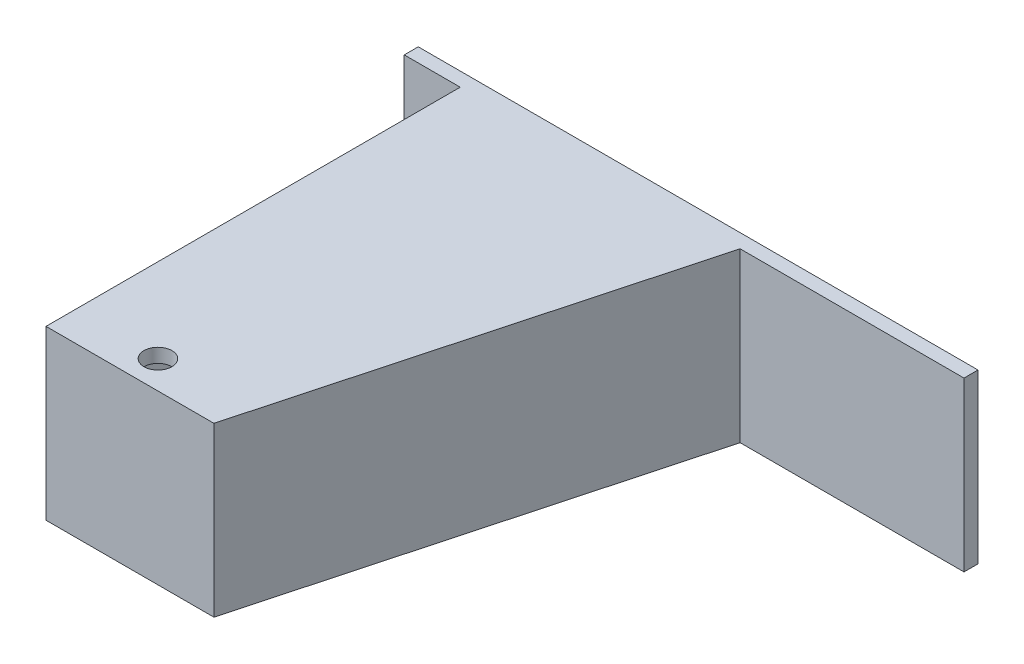
ISO-10303-21;
HEADER;
FILE_DESCRIPTION(('STEP AP214'),'2;1');
FILE_NAME('part.step','',(''),(''),'','','');
FILE_SCHEMA(('AUTOMOTIVE_DESIGN { 1 0 10303 214 1 1 1 1 }'));
ENDSEC;
DATA;
#1=APPLICATION_CONTEXT('core data for automotive mechanical design processes');
#2=APPLICATION_PROTOCOL_DEFINITION('international standard','automotive_design',2000,#1);
#3=PRODUCT_CONTEXT('',#1,'mechanical');
#4=PRODUCT('Part','Part','',(#3));
#5=PRODUCT_RELATED_PRODUCT_CATEGORY('part','',(#4));
#6=PRODUCT_DEFINITION_FORMATION('','',#4);
#7=PRODUCT_DEFINITION_CONTEXT('part definition',#1,'design');
#8=PRODUCT_DEFINITION('design','',#6,#7);
#9=PRODUCT_DEFINITION_SHAPE('','',#8);
#10=(LENGTH_UNIT() NAMED_UNIT(*) SI_UNIT(.MILLI.,.METRE.));
#11=(NAMED_UNIT(*) PLANE_ANGLE_UNIT() SI_UNIT($,.RADIAN.));
#12=(NAMED_UNIT(*) SI_UNIT($,.STERADIAN.) SOLID_ANGLE_UNIT());
#13=UNCERTAINTY_MEASURE_WITH_UNIT(LENGTH_MEASURE(1.E-05),#10,'distance_accuracy_value','');
#14=(GEOMETRIC_REPRESENTATION_CONTEXT(3) GLOBAL_UNCERTAINTY_ASSIGNED_CONTEXT((#13)) GLOBAL_UNIT_ASSIGNED_CONTEXT((#10,
#11,#12)) REPRESENTATION_CONTEXT('',''));
#15=CARTESIAN_POINT('',(0.,0.,0.));
#16=DIRECTION('',(0.,0.,1.));
#17=DIRECTION('',(1.,0.,0.));
#18=AXIS2_PLACEMENT_3D('',#15,#16,#17);
#19=CARTESIAN_POINT('',(19.05,38.1,-6.35));
#20=DIRECTION('',(0.,-1.,0.));
#21=DIRECTION('',(0.,0.,-1.));
#22=AXIS2_PLACEMENT_3D('',#19,#20,#21);
#23=CYLINDRICAL_SURFACE('',#22,3.175);
#24=CARTESIAN_POINT('',(19.05,34.925,-6.35));
#25=DIRECTION('',(0.,1.,0.));
#26=DIRECTION('',(0.,0.,1.));
#27=AXIS2_PLACEMENT_3D('',#24,#25,#26);
#28=CIRCLE('',#27,3.175);
#29=CARTESIAN_POINT('',(19.05,34.925,-3.175));
#30=VERTEX_POINT('',#29);
#31=EDGE_CURVE('E231',#30,#30,#28,.T.);
#32=ORIENTED_EDGE('',*,*,#31,.F.);
#33=EDGE_LOOP('',(#32));
#34=FACE_BOUND('',#33,.T.);
#35=CARTESIAN_POINT('',(19.05,38.1,-6.35));
#36=DIRECTION('',(0.,1.,0.));
#37=DIRECTION('',(0.,0.,1.));
#38=AXIS2_PLACEMENT_3D('',#35,#36,#37);
#39=CIRCLE('',#38,3.175);
#40=CARTESIAN_POINT('',(19.05,38.1,-3.175));
#41=VERTEX_POINT('',#40);
#42=EDGE_CURVE('E259',#41,#41,#39,.T.);
#43=ORIENTED_EDGE('',*,*,#42,.T.);
#44=EDGE_LOOP('',(#43));
#45=FACE_BOUND('',#44,.T.);
#46=ADVANCED_FACE('F85',(#34,#45),#23,.F.);
#47=CARTESIAN_POINT('',(19.05,3.175,-6.35));
#48=DIRECTION('',(0.,-1.,0.));
#49=DIRECTION('',(0.,0.,-1.));
#50=AXIS2_PLACEMENT_3D('',#47,#48,#49);
#51=CIRCLE('',#50,3.175);
#52=CARTESIAN_POINT('',(19.05,3.17500000000001,-3.175));
#53=VERTEX_POINT('',#52);
#54=EDGE_CURVE('E228',#53,#53,#51,.T.);
#55=ORIENTED_EDGE('',*,*,#54,.F.);
#56=EDGE_LOOP('',(#55));
#57=FACE_BOUND('',#56,.T.);
#58=CARTESIAN_POINT('',(19.05,0.,-6.35));
#59=DIRECTION('',(0.,1.,0.));
#60=DIRECTION('',(0.,0.,1.));
#61=AXIS2_PLACEMENT_3D('',#58,#59,#60);
#62=CIRCLE('',#61,3.175);
#63=CARTESIAN_POINT('',(19.05,0.,-3.175));
#64=VERTEX_POINT('',#63);
#65=EDGE_CURVE('E238',#64,#64,#62,.T.);
#66=ORIENTED_EDGE('',*,*,#65,.F.);
#67=EDGE_LOOP('',(#66));
#68=FACE_BOUND('',#67,.T.);
#69=ADVANCED_FACE('F345',(#57,#68),#23,.F.);
#70=CARTESIAN_POINT('',(0.,38.1,0.));
#71=DIRECTION('',(0.,0.,1.));
#72=DIRECTION('',(1.,0.,0.));
#73=AXIS2_PLACEMENT_3D('',#70,#71,#72);
#74=PLANE('',#73);
#75=DIRECTION('',(-1.,0.,0.));
#76=VECTOR('',#75,1.);
#77=CARTESIAN_POINT('',(0.,0.,0.));
#78=LINE('',#77,#76);
#79=CARTESIAN_POINT('',(38.1,0.,0.));
#80=VERTEX_POINT('',#79);
#81=CARTESIAN_POINT('',(0.,0.,0.));
#82=VERTEX_POINT('',#81);
#83=EDGE_CURVE('E265',#80,#82,#78,.T.);
#84=ORIENTED_EDGE('',*,*,#83,.F.);
#85=DIRECTION('',(0.,-1.,0.));
#86=VECTOR('',#85,1.);
#87=CARTESIAN_POINT('',(38.1,38.1,0.));
#88=LINE('',#87,#86);
#89=CARTESIAN_POINT('',(38.1,38.1,0.));
#90=VERTEX_POINT('',#89);
#91=EDGE_CURVE('E93',#90,#80,#88,.T.);
#92=ORIENTED_EDGE('',*,*,#91,.F.);
#93=DIRECTION('',(-1.,0.,0.));
#94=VECTOR('',#93,1.);
#95=CARTESIAN_POINT('',(0.,38.1,0.));
#96=LINE('',#95,#94);
#97=CARTESIAN_POINT('',(0.,38.1,0.));
#98=VERTEX_POINT('',#97);
#99=EDGE_CURVE('E237',#90,#98,#96,.T.);
#100=ORIENTED_EDGE('',*,*,#99,.T.);
#101=DIRECTION('',(0.,-1.,0.));
#102=VECTOR('',#101,1.);
#103=CARTESIAN_POINT('',(0.,38.1,0.));
#104=LINE('',#103,#102);
#105=EDGE_CURVE('E13',#98,#82,#104,.T.);
#106=ORIENTED_EDGE('',*,*,#105,.T.);
#107=EDGE_LOOP('',(#84,#92,#100,#106));
#108=FACE_BOUND('',#107,.T.);
#109=ADVANCED_FACE('F305',(#108),#74,.T.);
#110=CARTESIAN_POINT('',(35.5063989108237,38.1,9.59632402995234));
#111=DIRECTION('',(0.965363393028266,0.,0.260909025142775));
#112=DIRECTION('',(0.260909025142775,0.,-0.965363393028266));
#113=AXIS2_PLACEMENT_3D('',#110,#111,#112);
#114=PLANE('',#113);
#115=DIRECTION('',(-0.260909025142775,0.,0.965363393028266));
#116=VECTOR('',#115,1.);
#117=CARTESIAN_POINT('',(35.5063989108237,0.,9.59632402995234));
#118=LINE('',#117,#116);
#119=CARTESIAN_POINT('',(63.5,0.,-93.98));
#120=VERTEX_POINT('',#119);
#121=EDGE_CURVE('E268',#120,#80,#118,.T.);
#122=ORIENTED_EDGE('',*,*,#121,.F.);
#123=DIRECTION('',(0.,-1.,0.));
#124=VECTOR('',#123,1.);
#125=CARTESIAN_POINT('',(63.5,38.1,-93.98));
#126=LINE('',#125,#124);
#127=CARTESIAN_POINT('',(63.5,38.1,-93.98));
#128=VERTEX_POINT('',#127);
#129=EDGE_CURVE('E297',#128,#120,#126,.T.);
#130=ORIENTED_EDGE('',*,*,#129,.F.);
#131=DIRECTION('',(-0.260909025142775,0.,0.965363393028266));
#132=VECTOR('',#131,1.);
#133=CARTESIAN_POINT('',(35.5063989108237,38.1,9.59632402995234));
#134=LINE('',#133,#132);
#135=EDGE_CURVE('E241',#128,#90,#134,.T.);
#136=ORIENTED_EDGE('',*,*,#135,.T.);
#137=ORIENTED_EDGE('',*,*,#91,.T.);
#138=EDGE_LOOP('',(#122,#130,#136,#137));
#139=FACE_BOUND('',#138,.T.);
#140=ADVANCED_FACE('F301',(#139),#114,.T.);
#141=CARTESIAN_POINT('',(0.,38.1,-93.98));
#142=DIRECTION('',(0.,0.,1.));
#143=DIRECTION('',(1.,0.,0.));
#144=AXIS2_PLACEMENT_3D('',#141,#142,#143);
#145=PLANE('',#144);
#146=DIRECTION('',(-1.,0.,0.));
#147=VECTOR('',#146,1.);
#148=CARTESIAN_POINT('',(0.,0.,-93.98));
#149=LINE('',#148,#147);
#150=CARTESIAN_POINT('',(114.3,0.,-93.98));
#151=VERTEX_POINT('',#150);
#152=EDGE_CURVE('E271',#151,#120,#149,.T.);
#153=ORIENTED_EDGE('',*,*,#152,.F.);
#154=DIRECTION('',(0.,-1.,0.));
#155=VECTOR('',#154,1.);
#156=CARTESIAN_POINT('',(114.3,38.1,-93.98));
#157=LINE('',#156,#155);
#158=CARTESIAN_POINT('',(114.3,38.1,-93.98));
#159=VERTEX_POINT('',#158);
#160=EDGE_CURVE('E295',#159,#151,#157,.T.);
#161=ORIENTED_EDGE('',*,*,#160,.F.);
#162=DIRECTION('',(-1.,0.,0.));
#163=VECTOR('',#162,1.);
#164=CARTESIAN_POINT('',(0.,38.1,-93.98));
#165=LINE('',#164,#163);
#166=EDGE_CURVE('E244',#159,#128,#165,.T.);
#167=ORIENTED_EDGE('',*,*,#166,.T.);
#168=ORIENTED_EDGE('',*,*,#129,.T.);
#169=EDGE_LOOP('',(#153,#161,#167,#168));
#170=FACE_BOUND('',#169,.T.);
#171=ADVANCED_FACE('F313',(#170),#145,.T.);
#172=CARTESIAN_POINT('',(114.3,38.1,4.99600361081317E-13));
#173=DIRECTION('',(1.,0.,0.));
#174=DIRECTION('',(0.,0.,-1.));
#175=AXIS2_PLACEMENT_3D('',#172,#173,#174);
#176=PLANE('',#175);
#177=DIRECTION('',(0.,0.,1.));
#178=VECTOR('',#177,1.);
#179=CARTESIAN_POINT('',(114.3,0.,4.99600361081317E-13));
#180=LINE('',#179,#178);
#181=CARTESIAN_POINT('',(114.3,0.,-97.155));
#182=VERTEX_POINT('',#181);
#183=EDGE_CURVE('E274',#182,#151,#180,.T.);
#184=ORIENTED_EDGE('',*,*,#183,.F.);
#185=DIRECTION('',(0.,-1.,0.));
#186=VECTOR('',#185,1.);
#187=CARTESIAN_POINT('',(114.3,38.1,-97.155));
#188=LINE('',#187,#186);
#189=CARTESIAN_POINT('',(114.3,38.1,-97.155));
#190=VERTEX_POINT('',#189);
#191=EDGE_CURVE('E292',#190,#182,#188,.T.);
#192=ORIENTED_EDGE('',*,*,#191,.F.);
#193=DIRECTION('',(0.,0.,1.));
#194=VECTOR('',#193,1.);
#195=CARTESIAN_POINT('',(114.3,38.1,4.99600361081317E-13));
#196=LINE('',#195,#194);
#197=EDGE_CURVE('E247',#190,#159,#196,.T.);
#198=ORIENTED_EDGE('',*,*,#197,.T.);
#199=ORIENTED_EDGE('',*,*,#160,.T.);
#200=EDGE_LOOP('',(#184,#192,#198,#199));
#201=FACE_BOUND('',#200,.T.);
#202=ADVANCED_FACE('F334',(#201),#176,.T.);
#203=CARTESIAN_POINT('',(0.,38.1,-97.155));
#204=DIRECTION('',(0.,0.,-1.));
#205=DIRECTION('',(-1.,0.,0.));
#206=AXIS2_PLACEMENT_3D('',#203,#204,#205);
#207=PLANE('',#206);
#208=DIRECTION('',(0.,-1.,0.));
#209=VECTOR('',#208,1.);
#210=CARTESIAN_POINT('',(60.2110830771816,148.033412449479,-97.155));
#211=LINE('',#210,#209);
#212=CARTESIAN_POINT('',(60.2110830771816,34.925,-97.155));
#213=VERTEX_POINT('',#212);
#214=CARTESIAN_POINT('',(60.2110830771816,3.175,-97.155));
#215=VERTEX_POINT('',#214);
#216=EDGE_CURVE('E215',#213,#215,#211,.T.);
#217=ORIENTED_EDGE('',*,*,#216,.F.);
#218=DIRECTION('',(1.,0.,0.));
#219=VECTOR('',#218,1.);
#220=CARTESIAN_POINT('',(3.175,34.925,-97.155));
#221=LINE('',#220,#219);
#222=CARTESIAN_POINT('',(3.175,34.925,-97.155));
#223=VERTEX_POINT('',#222);
#224=EDGE_CURVE('E205',#223,#213,#221,.T.);
#225=ORIENTED_EDGE('',*,*,#224,.F.);
#226=DIRECTION('',(0.,-1.,0.));
#227=VECTOR('',#226,1.);
#228=CARTESIAN_POINT('',(3.175,148.033412449479,-97.155));
#229=LINE('',#228,#227);
#230=CARTESIAN_POINT('',(3.175,3.175,-97.155));
#231=VERTEX_POINT('',#230);
#232=EDGE_CURVE('E216',#223,#231,#229,.T.);
#233=ORIENTED_EDGE('',*,*,#232,.T.);
#234=DIRECTION('',(1.,0.,0.));
#235=VECTOR('',#234,1.);
#236=CARTESIAN_POINT('',(3.175,3.175,-97.155));
#237=LINE('',#236,#235);
#238=EDGE_CURVE('E212',#231,#215,#237,.T.);
#239=ORIENTED_EDGE('',*,*,#238,.T.);
#240=EDGE_LOOP('',(#217,#225,#233,#239));
#241=FACE_BOUND('',#240,.T.);
#242=DIRECTION('',(1.,0.,0.));
#243=VECTOR('',#242,1.);
#244=CARTESIAN_POINT('',(0.,0.,-97.155));
#245=LINE('',#244,#243);
#246=CARTESIAN_POINT('',(-12.7,0.,-97.155));
#247=VERTEX_POINT('',#246);
#248=EDGE_CURVE('E277',#247,#182,#245,.T.);
#249=ORIENTED_EDGE('',*,*,#248,.F.);
#250=DIRECTION('',(0.,-1.,0.));
#251=VECTOR('',#250,1.);
#252=CARTESIAN_POINT('',(-12.7,38.1,-97.155));
#253=LINE('',#252,#251);
#254=CARTESIAN_POINT('',(-12.7,38.1,-97.155));
#255=VERTEX_POINT('',#254);
#256=EDGE_CURVE('E290',#255,#247,#253,.T.);
#257=ORIENTED_EDGE('',*,*,#256,.F.);
#258=DIRECTION('',(1.,0.,0.));
#259=VECTOR('',#258,1.);
#260=CARTESIAN_POINT('',(0.,38.1,-97.155));
#261=LINE('',#260,#259);
#262=EDGE_CURVE('E250',#255,#190,#261,.T.);
#263=ORIENTED_EDGE('',*,*,#262,.T.);
#264=ORIENTED_EDGE('',*,*,#191,.T.);
#265=EDGE_LOOP('',(#249,#257,#263,#264));
#266=FACE_BOUND('',#265,.T.);
#267=ADVANCED_FACE('F332',(#241,#266),#207,.T.);
#268=CARTESIAN_POINT('',(-12.7000000000001,38.1,0.));
#269=DIRECTION('',(-1.,0.,0.));
#270=DIRECTION('',(0.,0.,1.));
#271=AXIS2_PLACEMENT_3D('',#268,#269,#270);
#272=PLANE('',#271);
#273=DIRECTION('',(0.,0.,-1.));
#274=VECTOR('',#273,1.);
#275=CARTESIAN_POINT('',(-12.7000000000001,0.,0.));
#276=LINE('',#275,#274);
#277=CARTESIAN_POINT('',(-12.7,0.,-93.98));
#278=VERTEX_POINT('',#277);
#279=EDGE_CURVE('E279',#278,#247,#276,.T.);
#280=ORIENTED_EDGE('',*,*,#279,.F.);
#281=DIRECTION('',(0.,-1.,0.));
#282=VECTOR('',#281,1.);
#283=CARTESIAN_POINT('',(-12.7,38.1,-93.98));
#284=LINE('',#283,#282);
#285=CARTESIAN_POINT('',(-12.7,38.1,-93.98));
#286=VERTEX_POINT('',#285);
#287=EDGE_CURVE('E288',#286,#278,#284,.T.);
#288=ORIENTED_EDGE('',*,*,#287,.F.);
#289=DIRECTION('',(0.,0.,-1.));
#290=VECTOR('',#289,1.);
#291=CARTESIAN_POINT('',(-12.7000000000001,38.1,0.));
#292=LINE('',#291,#290);
#293=EDGE_CURVE('E253',#286,#255,#292,.T.);
#294=ORIENTED_EDGE('',*,*,#293,.T.);
#295=ORIENTED_EDGE('',*,*,#256,.T.);
#296=EDGE_LOOP('',(#280,#288,#294,#295));
#297=FACE_BOUND('',#296,.T.);
#298=ADVANCED_FACE('F328',(#297),#272,.T.);
#299=CARTESIAN_POINT('',(0.,38.1,-93.98));
#300=DIRECTION('',(0.,0.,1.));
#301=DIRECTION('',(1.,0.,0.));
#302=AXIS2_PLACEMENT_3D('',#299,#300,#301);
#303=PLANE('',#302);
#304=DIRECTION('',(-1.,0.,0.));
#305=VECTOR('',#304,1.);
#306=CARTESIAN_POINT('',(0.,0.,-93.98));
#307=LINE('',#306,#305);
#308=CARTESIAN_POINT('',(0.,0.,-93.98));
#309=VERTEX_POINT('',#308);
#310=EDGE_CURVE('E282',#309,#278,#307,.T.);
#311=ORIENTED_EDGE('',*,*,#310,.F.);
#312=DIRECTION('',(0.,-1.,0.));
#313=VECTOR('',#312,1.);
#314=CARTESIAN_POINT('',(0.,38.1,-93.98));
#315=LINE('',#314,#313);
#316=CARTESIAN_POINT('',(0.,38.1,-93.98));
#317=VERTEX_POINT('',#316);
#318=EDGE_CURVE('E262',#317,#309,#315,.T.);
#319=ORIENTED_EDGE('',*,*,#318,.F.);
#320=DIRECTION('',(-1.,0.,0.));
#321=VECTOR('',#320,1.);
#322=CARTESIAN_POINT('',(0.,38.1,-93.98));
#323=LINE('',#322,#321);
#324=EDGE_CURVE('E256',#317,#286,#323,.T.);
#325=ORIENTED_EDGE('',*,*,#324,.T.);
#326=ORIENTED_EDGE('',*,*,#287,.T.);
#327=EDGE_LOOP('',(#311,#319,#325,#326));
#328=FACE_BOUND('',#327,.T.);
#329=ADVANCED_FACE('F325',(#328),#303,.T.);
#330=CARTESIAN_POINT('',(0.,38.1,0.));
#331=DIRECTION('',(-1.,0.,0.));
#332=DIRECTION('',(0.,0.,1.));
#333=AXIS2_PLACEMENT_3D('',#330,#331,#332);
#334=PLANE('',#333);
#335=DIRECTION('',(0.,0.,-1.));
#336=VECTOR('',#335,1.);
#337=CARTESIAN_POINT('',(0.,0.,0.));
#338=LINE('',#337,#336);
#339=EDGE_CURVE('E233',#82,#309,#338,.T.);
#340=ORIENTED_EDGE('',*,*,#339,.F.);
#341=ORIENTED_EDGE('',*,*,#105,.F.);
#342=DIRECTION('',(0.,0.,-1.));
#343=VECTOR('',#342,1.);
#344=CARTESIAN_POINT('',(0.,38.1,0.));
#345=LINE('',#344,#343);
#346=EDGE_CURVE('E234',#98,#317,#345,.T.);
#347=ORIENTED_EDGE('',*,*,#346,.T.);
#348=ORIENTED_EDGE('',*,*,#318,.T.);
#349=EDGE_LOOP('',(#340,#341,#347,#348));
#350=FACE_BOUND('',#349,.T.);
#351=ADVANCED_FACE('F87',(#350),#334,.T.);
#352=CARTESIAN_POINT('',(0.,0.,0.));
#353=DIRECTION('',(0.,1.,0.));
#354=DIRECTION('',(0.,0.,1.));
#355=AXIS2_PLACEMENT_3D('',#352,#353,#354);
#356=PLANE('',#355);
#357=ORIENTED_EDGE('',*,*,#248,.T.);
#358=ORIENTED_EDGE('',*,*,#183,.T.);
#359=ORIENTED_EDGE('',*,*,#152,.T.);
#360=ORIENTED_EDGE('',*,*,#121,.T.);
#361=ORIENTED_EDGE('',*,*,#83,.T.);
#362=ORIENTED_EDGE('',*,*,#339,.T.);
#363=ORIENTED_EDGE('',*,*,#310,.T.);
#364=ORIENTED_EDGE('',*,*,#279,.T.);
#365=EDGE_LOOP('',(#357,#358,#359,#360,#361,#362,#363,#364));
#366=FACE_BOUND('',#365,.T.);
#367=ORIENTED_EDGE('',*,*,#65,.T.);
#368=EDGE_LOOP('',(#367));
#369=FACE_BOUND('',#368,.T.);
#370=ADVANCED_FACE('F308',(#366,#369),#356,.F.);
#371=CARTESIAN_POINT('',(0.,38.1,0.));
#372=DIRECTION('',(0.,1.,0.));
#373=DIRECTION('',(0.,0.,1.));
#374=AXIS2_PLACEMENT_3D('',#371,#372,#373);
#375=PLANE('',#374);
#376=ORIENTED_EDGE('',*,*,#262,.F.);
#377=ORIENTED_EDGE('',*,*,#293,.F.);
#378=ORIENTED_EDGE('',*,*,#324,.F.);
#379=ORIENTED_EDGE('',*,*,#346,.F.);
#380=ORIENTED_EDGE('',*,*,#99,.F.);
#381=ORIENTED_EDGE('',*,*,#135,.F.);
#382=ORIENTED_EDGE('',*,*,#166,.F.);
#383=ORIENTED_EDGE('',*,*,#197,.F.);
#384=EDGE_LOOP('',(#376,#377,#378,#379,#380,#381,#382,#383));
#385=FACE_BOUND('',#384,.T.);
#386=ORIENTED_EDGE('',*,*,#42,.F.);
#387=EDGE_LOOP('',(#386));
#388=FACE_BOUND('',#387,.T.);
#389=ADVANCED_FACE('F316',(#385,#388),#375,.T.);
#390=CARTESIAN_POINT('',(35.6691911852898,148.033412449479,-3.175));
#391=DIRECTION('',(0.,0.,1.));
#392=DIRECTION('',(1.,0.,0.));
#393=AXIS2_PLACEMENT_3D('',#390,#391,#392);
#394=PLANE('',#393);
#395=DIRECTION('',(-1.,0.,0.));
#396=VECTOR('',#395,1.);
#397=CARTESIAN_POINT('',(35.6691911852898,34.925,-3.175));
#398=LINE('',#397,#396);
#399=CARTESIAN_POINT('',(35.6691911852898,34.925,-3.175));
#400=VERTEX_POINT('',#399);
#401=EDGE_CURVE('E108',#400,#30,#398,.T.);
#402=ORIENTED_EDGE('',*,*,#401,.F.);
#403=DIRECTION('',(0.,-1.,0.));
#404=VECTOR('',#403,1.);
#405=CARTESIAN_POINT('',(35.6691911852898,148.033412449479,-3.175));
#406=LINE('',#405,#404);
#407=CARTESIAN_POINT('',(35.6691911852898,3.175,-3.175));
#408=VERTEX_POINT('',#407);
#409=EDGE_CURVE('E191',#400,#408,#406,.T.);
#410=ORIENTED_EDGE('',*,*,#409,.T.);
#411=DIRECTION('',(-1.,0.,0.));
#412=VECTOR('',#411,1.);
#413=CARTESIAN_POINT('',(35.6691911852898,3.175,-3.175));
#414=LINE('',#413,#412);
#415=EDGE_CURVE('E100',#408,#53,#414,.T.);
#416=ORIENTED_EDGE('',*,*,#415,.T.);
#417=CARTESIAN_POINT('',(3.175,3.175,-3.175));
#418=VERTEX_POINT('',#417);
#419=EDGE_CURVE('E581',#53,#418,#414,.T.);
#420=ORIENTED_EDGE('',*,*,#419,.T.);
#421=DIRECTION('',(0.,-1.,0.));
#422=VECTOR('',#421,1.);
#423=CARTESIAN_POINT('',(3.175,148.033412449479,-3.175));
#424=LINE('',#423,#422);
#425=CARTESIAN_POINT('',(3.175,34.925,-3.175));
#426=VERTEX_POINT('',#425);
#427=EDGE_CURVE('E219',#426,#418,#424,.T.);
#428=ORIENTED_EDGE('',*,*,#427,.F.);
#429=EDGE_CURVE('E220',#30,#426,#398,.T.);
#430=ORIENTED_EDGE('',*,*,#429,.F.);
#431=EDGE_LOOP('',(#402,#410,#416,#420,#428,#430));
#432=FACE_BOUND('',#431,.T.);
#433=ADVANCED_FACE('F384',(#432),#394,.F.);
#434=CARTESIAN_POINT('',(0.,34.925,0.));
#435=DIRECTION('',(0.,1.,0.));
#436=DIRECTION('',(0.,0.,1.));
#437=AXIS2_PLACEMENT_3D('',#434,#435,#436);
#438=PLANE('',#437);
#439=ORIENTED_EDGE('',*,*,#429,.T.);
#440=DIRECTION('',(0.,0.,-1.));
#441=VECTOR('',#440,1.);
#442=CARTESIAN_POINT('',(3.175,34.925,-93.98));
#443=LINE('',#442,#441);
#444=EDGE_CURVE('E217',#426,#223,#443,.T.);
#445=ORIENTED_EDGE('',*,*,#444,.T.);
#446=ORIENTED_EDGE('',*,*,#224,.T.);
#447=DIRECTION('',(0.,0.,1.));
#448=VECTOR('',#447,1.);
#449=CARTESIAN_POINT('',(60.2110830771816,34.925,-97.155));
#450=LINE('',#449,#448);
#451=CARTESIAN_POINT('',(60.2110830771816,34.925,-93.98));
#452=VERTEX_POINT('',#451);
#453=EDGE_CURVE('E197',#213,#452,#450,.T.);
#454=ORIENTED_EDGE('',*,*,#453,.T.);
#455=DIRECTION('',(-0.260909025142775,0.,0.965363393028266));
#456=VECTOR('',#455,1.);
#457=CARTESIAN_POINT('',(60.2110830771816,34.925,-93.98));
#458=LINE('',#457,#456);
#459=EDGE_CURVE('E185',#452,#400,#458,.T.);
#460=ORIENTED_EDGE('',*,*,#459,.T.);
#461=ORIENTED_EDGE('',*,*,#401,.T.);
#462=ORIENTED_EDGE('',*,*,#31,.T.);
#463=EDGE_LOOP('',(#439,#445,#446,#454,#460,#461,#462));
#464=FACE_BOUND('',#463,.T.);
#465=ADVANCED_FACE('F202',(#464),#438,.F.);
#466=CARTESIAN_POINT('',(0.,3.175,0.));
#467=DIRECTION('',(0.,-1.,0.));
#468=DIRECTION('',(0.,0.,-1.));
#469=AXIS2_PLACEMENT_3D('',#466,#467,#468);
#470=PLANE('',#469);
#471=ORIENTED_EDGE('',*,*,#415,.F.);
#472=DIRECTION('',(-0.260909025142775,0.,0.965363393028266));
#473=VECTOR('',#472,1.);
#474=CARTESIAN_POINT('',(60.2110830771816,3.175,-93.98));
#475=LINE('',#474,#473);
#476=CARTESIAN_POINT('',(60.2110830771816,3.175,-93.98));
#477=VERTEX_POINT('',#476);
#478=EDGE_CURVE('E583',#477,#408,#475,.T.);
#479=ORIENTED_EDGE('',*,*,#478,.F.);
#480=DIRECTION('',(0.,0.,1.));
#481=VECTOR('',#480,1.);
#482=CARTESIAN_POINT('',(60.2110830771816,3.175,-97.155));
#483=LINE('',#482,#481);
#484=EDGE_CURVE('E200',#215,#477,#483,.T.);
#485=ORIENTED_EDGE('',*,*,#484,.F.);
#486=ORIENTED_EDGE('',*,*,#238,.F.);
#487=DIRECTION('',(0.,0.,-1.));
#488=VECTOR('',#487,1.);
#489=CARTESIAN_POINT('',(3.175,3.175,-93.98));
#490=LINE('',#489,#488);
#491=EDGE_CURVE('E207',#418,#231,#490,.T.);
#492=ORIENTED_EDGE('',*,*,#491,.F.);
#493=ORIENTED_EDGE('',*,*,#419,.F.);
#494=ORIENTED_EDGE('',*,*,#54,.T.);
#495=EDGE_LOOP('',(#471,#479,#485,#486,#492,#493,#494));
#496=FACE_BOUND('',#495,.T.);
#497=ADVANCED_FACE('F396',(#496),#470,.F.);
#498=CARTESIAN_POINT('',(60.2110830771816,148.033412449479,-97.155));
#499=DIRECTION('',(1.,0.,0.));
#500=DIRECTION('',(0.,0.,-1.));
#501=AXIS2_PLACEMENT_3D('',#498,#499,#500);
#502=PLANE('',#501);
#503=ORIENTED_EDGE('',*,*,#216,.T.);
#504=ORIENTED_EDGE('',*,*,#484,.T.);
#505=DIRECTION('',(0.,-1.,0.));
#506=VECTOR('',#505,1.);
#507=CARTESIAN_POINT('',(60.2110830771816,148.033412449479,-93.98));
#508=LINE('',#507,#506);
#509=EDGE_CURVE('E189',#452,#477,#508,.T.);
#510=ORIENTED_EDGE('',*,*,#509,.F.);
#511=ORIENTED_EDGE('',*,*,#453,.F.);
#512=EDGE_LOOP('',(#503,#504,#510,#511));
#513=FACE_BOUND('',#512,.T.);
#514=ADVANCED_FACE('F196',(#513),#502,.F.);
#515=CARTESIAN_POINT('',(60.2110830771816,148.033412449479,-93.98));
#516=DIRECTION('',(0.965363393028266,0.,0.260909025142775));
#517=DIRECTION('',(0.260909025142775,0.,-0.965363393028266));
#518=AXIS2_PLACEMENT_3D('',#515,#516,#517);
#519=PLANE('',#518);
#520=ORIENTED_EDGE('',*,*,#509,.T.);
#521=ORIENTED_EDGE('',*,*,#478,.T.);
#522=ORIENTED_EDGE('',*,*,#409,.F.);
#523=ORIENTED_EDGE('',*,*,#459,.F.);
#524=EDGE_LOOP('',(#520,#521,#522,#523));
#525=FACE_BOUND('',#524,.T.);
#526=ADVANCED_FACE('F187',(#525),#519,.F.);
#527=CARTESIAN_POINT('',(3.175,148.033412449479,-93.98));
#528=DIRECTION('',(-1.,0.,0.));
#529=DIRECTION('',(0.,0.,1.));
#530=AXIS2_PLACEMENT_3D('',#527,#528,#529);
#531=PLANE('',#530);
#532=ORIENTED_EDGE('',*,*,#427,.T.);
#533=ORIENTED_EDGE('',*,*,#491,.T.);
#534=ORIENTED_EDGE('',*,*,#232,.F.);
#535=ORIENTED_EDGE('',*,*,#444,.F.);
#536=EDGE_LOOP('',(#532,#533,#534,#535));
#537=FACE_BOUND('',#536,.T.);
#538=ADVANCED_FACE('F416',(#537),#531,.F.);
#539=CLOSED_SHELL('',(#46,#69,#109,#140,#171,#202,#267,#298,#329,#351,#370,#389,#433,#465,#497,
#514,#526,#538));
#540=MANIFOLD_SOLID_BREP('B2',#539);
#541=ADVANCED_BREP_SHAPE_REPRESENTATION('',(#18,#540),#14);
#542=SHAPE_DEFINITION_REPRESENTATION(#9,#541);
ENDSEC;
END-ISO-10303-21;
